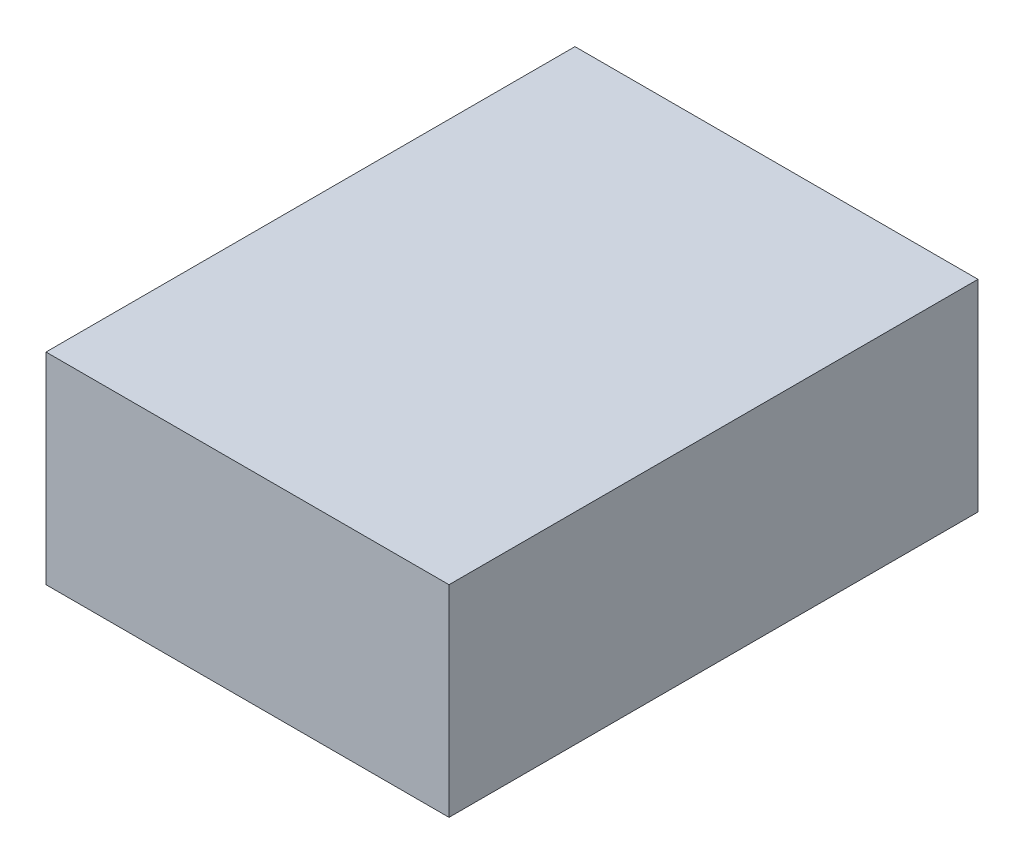
ISO-10303-21;
HEADER;
FILE_DESCRIPTION(('STEP AP214'),'2;1');
FILE_NAME('part.step','',(''),(''),'','','');
FILE_SCHEMA(('AUTOMOTIVE_DESIGN { 1 0 10303 214 1 1 1 1 }'));
ENDSEC;
DATA;
#1=APPLICATION_CONTEXT('core data for automotive mechanical design processes');
#2=APPLICATION_PROTOCOL_DEFINITION('international standard','automotive_design',2000,#1);
#3=PRODUCT_CONTEXT('',#1,'mechanical');
#4=PRODUCT('Part','Part','',(#3));
#5=PRODUCT_RELATED_PRODUCT_CATEGORY('part','',(#4));
#6=PRODUCT_DEFINITION_FORMATION('','',#4);
#7=PRODUCT_DEFINITION_CONTEXT('part definition',#1,'design');
#8=PRODUCT_DEFINITION('design','',#6,#7);
#9=PRODUCT_DEFINITION_SHAPE('','',#8);
#10=(LENGTH_UNIT() NAMED_UNIT(*) SI_UNIT(.MILLI.,.METRE.));
#11=(NAMED_UNIT(*) PLANE_ANGLE_UNIT() SI_UNIT($,.RADIAN.));
#12=(NAMED_UNIT(*) SI_UNIT($,.STERADIAN.) SOLID_ANGLE_UNIT());
#13=UNCERTAINTY_MEASURE_WITH_UNIT(LENGTH_MEASURE(1.E-05),#10,'distance_accuracy_value','');
#14=(GEOMETRIC_REPRESENTATION_CONTEXT(3) GLOBAL_UNCERTAINTY_ASSIGNED_CONTEXT((#13)) GLOBAL_UNIT_ASSIGNED_CONTEXT((#10,
#11,#12)) REPRESENTATION_CONTEXT('',''));
#15=CARTESIAN_POINT('',(0.,0.,0.));
#16=DIRECTION('',(0.,0.,1.));
#17=DIRECTION('',(1.,0.,0.));
#18=AXIS2_PLACEMENT_3D('',#15,#16,#17);
#19=CARTESIAN_POINT('',(0.,0.,133.35));
#20=DIRECTION('',(1.,0.,0.));
#21=DIRECTION('',(0.,0.,-1.));
#22=AXIS2_PLACEMENT_3D('',#19,#20,#21);
#23=PLANE('',#22);
#24=DIRECTION('',(0.,-1.,0.));
#25=VECTOR('',#24,1.);
#26=CARTESIAN_POINT('',(0.,0.,0.));
#27=LINE('',#26,#25);
#28=CARTESIAN_POINT('',(0.,50.8,0.));
#29=VERTEX_POINT('',#28);
#30=CARTESIAN_POINT('',(0.,0.,0.));
#31=VERTEX_POINT('',#30);
#32=EDGE_CURVE('E100',#29,#31,#27,.T.);
#33=ORIENTED_EDGE('',*,*,#32,.T.);
#34=DIRECTION('',(0.,0.,-1.));
#35=VECTOR('',#34,1.);
#36=CARTESIAN_POINT('',(0.,0.,133.35));
#37=LINE('',#36,#35);
#38=CARTESIAN_POINT('',(0.,0.,133.35));
#39=VERTEX_POINT('',#38);
#40=EDGE_CURVE('E11',#39,#31,#37,.T.);
#41=ORIENTED_EDGE('',*,*,#40,.F.);
#42=DIRECTION('',(0.,-1.,0.));
#43=VECTOR('',#42,1.);
#44=CARTESIAN_POINT('',(0.,0.,133.35));
#45=LINE('',#44,#43);
#46=CARTESIAN_POINT('',(0.,50.8,133.35));
#47=VERTEX_POINT('',#46);
#48=EDGE_CURVE('E88',#47,#39,#45,.T.);
#49=ORIENTED_EDGE('',*,*,#48,.F.);
#50=DIRECTION('',(0.,0.,-1.));
#51=VECTOR('',#50,1.);
#52=CARTESIAN_POINT('',(0.,50.8,133.35));
#53=LINE('',#52,#51);
#54=EDGE_CURVE('E96',#47,#29,#53,.T.);
#55=ORIENTED_EDGE('',*,*,#54,.T.);
#56=EDGE_LOOP('',(#33,#41,#49,#55));
#57=FACE_BOUND('',#56,.T.);
#58=ADVANCED_FACE('F37',(#57),#23,.F.);
#59=CARTESIAN_POINT('',(0.,0.,133.35));
#60=DIRECTION('',(0.,1.,0.));
#61=DIRECTION('',(0.,0.,1.));
#62=AXIS2_PLACEMENT_3D('',#59,#60,#61);
#63=PLANE('',#62);
#64=DIRECTION('',(1.,0.,0.));
#65=VECTOR('',#64,1.);
#66=CARTESIAN_POINT('',(0.,0.,0.));
#67=LINE('',#66,#65);
#68=CARTESIAN_POINT('',(101.6,0.,0.));
#69=VERTEX_POINT('',#68);
#70=EDGE_CURVE('E92',#31,#69,#67,.T.);
#71=ORIENTED_EDGE('',*,*,#70,.T.);
#72=DIRECTION('',(0.,0.,-1.));
#73=VECTOR('',#72,1.);
#74=CARTESIAN_POINT('',(101.6,0.,133.35));
#75=LINE('',#74,#73);
#76=CARTESIAN_POINT('',(101.6,0.,133.35));
#77=VERTEX_POINT('',#76);
#78=EDGE_CURVE('E45',#77,#69,#75,.T.);
#79=ORIENTED_EDGE('',*,*,#78,.F.);
#80=DIRECTION('',(1.,0.,0.));
#81=VECTOR('',#80,1.);
#82=CARTESIAN_POINT('',(0.,0.,133.35));
#83=LINE('',#82,#81);
#84=EDGE_CURVE('E83',#39,#77,#83,.T.);
#85=ORIENTED_EDGE('',*,*,#84,.F.);
#86=ORIENTED_EDGE('',*,*,#40,.T.);
#87=EDGE_LOOP('',(#71,#79,#85,#86));
#88=FACE_BOUND('',#87,.T.);
#89=ADVANCED_FACE('F91',(#88),#63,.F.);
#90=CARTESIAN_POINT('',(101.6,0.,133.35));
#91=DIRECTION('',(-1.,0.,0.));
#92=DIRECTION('',(0.,0.,1.));
#93=AXIS2_PLACEMENT_3D('',#90,#91,#92);
#94=PLANE('',#93);
#95=DIRECTION('',(0.,1.,0.));
#96=VECTOR('',#95,1.);
#97=CARTESIAN_POINT('',(101.6,0.,0.));
#98=LINE('',#97,#96);
#99=CARTESIAN_POINT('',(101.6,50.8,0.));
#100=VERTEX_POINT('',#99);
#101=EDGE_CURVE('E70',#69,#100,#98,.T.);
#102=ORIENTED_EDGE('',*,*,#101,.T.);
#103=DIRECTION('',(0.,0.,-1.));
#104=VECTOR('',#103,1.);
#105=CARTESIAN_POINT('',(101.6,50.8,133.35));
#106=LINE('',#105,#104);
#107=CARTESIAN_POINT('',(101.6,50.8,133.35));
#108=VERTEX_POINT('',#107);
#109=EDGE_CURVE('E93',#108,#100,#106,.T.);
#110=ORIENTED_EDGE('',*,*,#109,.F.);
#111=DIRECTION('',(0.,1.,0.));
#112=VECTOR('',#111,1.);
#113=CARTESIAN_POINT('',(101.6,0.,133.35));
#114=LINE('',#113,#112);
#115=EDGE_CURVE('E86',#77,#108,#114,.T.);
#116=ORIENTED_EDGE('',*,*,#115,.F.);
#117=ORIENTED_EDGE('',*,*,#78,.T.);
#118=EDGE_LOOP('',(#102,#110,#116,#117));
#119=FACE_BOUND('',#118,.T.);
#120=ADVANCED_FACE('F94',(#119),#94,.F.);
#121=CARTESIAN_POINT('',(0.,50.8,133.35));
#122=DIRECTION('',(0.,-1.,0.));
#123=DIRECTION('',(0.,0.,-1.));
#124=AXIS2_PLACEMENT_3D('',#121,#122,#123);
#125=PLANE('',#124);
#126=DIRECTION('',(-1.,0.,0.));
#127=VECTOR('',#126,1.);
#128=CARTESIAN_POINT('',(0.,50.8,0.));
#129=LINE('',#128,#127);
#130=EDGE_CURVE('E76',#100,#29,#129,.T.);
#131=ORIENTED_EDGE('',*,*,#130,.T.);
#132=ORIENTED_EDGE('',*,*,#54,.F.);
#133=DIRECTION('',(-1.,0.,0.));
#134=VECTOR('',#133,1.);
#135=CARTESIAN_POINT('',(0.,50.8,133.35));
#136=LINE('',#135,#134);
#137=EDGE_CURVE('E53',#108,#47,#136,.T.);
#138=ORIENTED_EDGE('',*,*,#137,.F.);
#139=ORIENTED_EDGE('',*,*,#109,.T.);
#140=EDGE_LOOP('',(#131,#132,#138,#139));
#141=FACE_BOUND('',#140,.T.);
#142=ADVANCED_FACE('F107',(#141),#125,.F.);
#143=CARTESIAN_POINT('',(0.,0.,133.35));
#144=DIRECTION('',(0.,0.,-1.));
#145=DIRECTION('',(-1.,0.,0.));
#146=AXIS2_PLACEMENT_3D('',#143,#144,#145);
#147=PLANE('',#146);
#148=ORIENTED_EDGE('',*,*,#48,.T.);
#149=ORIENTED_EDGE('',*,*,#84,.T.);
#150=ORIENTED_EDGE('',*,*,#115,.T.);
#151=ORIENTED_EDGE('',*,*,#137,.T.);
#152=EDGE_LOOP('',(#148,#149,#150,#151));
#153=FACE_BOUND('',#152,.T.);
#154=ADVANCED_FACE('F84',(#153),#147,.F.);
#155=CARTESIAN_POINT('',(0.,0.,0.));
#156=DIRECTION('',(0.,0.,-1.));
#157=DIRECTION('',(-1.,0.,0.));
#158=AXIS2_PLACEMENT_3D('',#155,#156,#157);
#159=PLANE('',#158);
#160=ORIENTED_EDGE('',*,*,#32,.F.);
#161=ORIENTED_EDGE('',*,*,#130,.F.);
#162=ORIENTED_EDGE('',*,*,#101,.F.);
#163=ORIENTED_EDGE('',*,*,#70,.F.);
#164=EDGE_LOOP('',(#160,#161,#162,#163));
#165=FACE_BOUND('',#164,.T.);
#166=ADVANCED_FACE('F110',(#165),#159,.T.);
#167=CLOSED_SHELL('',(#58,#89,#120,#142,#154,#166));
#168=MANIFOLD_SOLID_BREP('B2',#167);
#169=ADVANCED_BREP_SHAPE_REPRESENTATION('',(#18,#168),#14);
#170=SHAPE_DEFINITION_REPRESENTATION(#9,#169);
ENDSEC;
END-ISO-10303-21;
